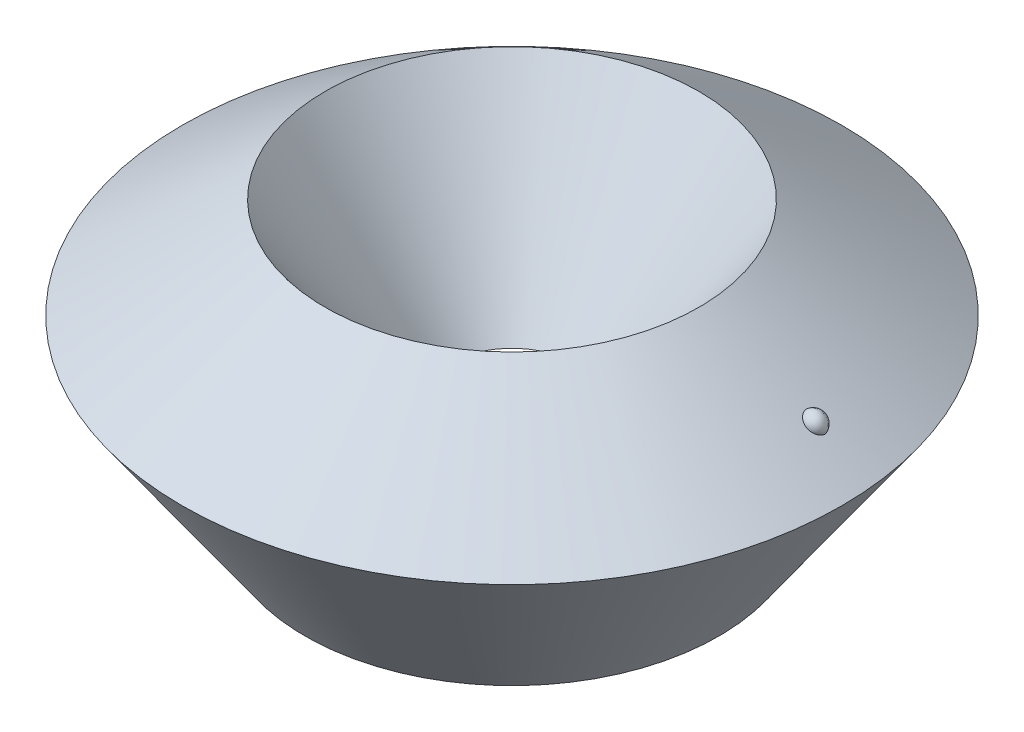
ISO-10303-21;
HEADER;
FILE_DESCRIPTION(('STEP AP214'),'2;1');
FILE_NAME('part.step','',(''),(''),'','','');
FILE_SCHEMA(('AUTOMOTIVE_DESIGN { 1 0 10303 214 1 1 1 1 }'));
ENDSEC;
DATA;
#1=APPLICATION_CONTEXT('core data for automotive mechanical design processes');
#2=APPLICATION_PROTOCOL_DEFINITION('international standard','automotive_design',2000,#1);
#3=PRODUCT_CONTEXT('',#1,'mechanical');
#4=PRODUCT('Part','Part','',(#3));
#5=PRODUCT_RELATED_PRODUCT_CATEGORY('part','',(#4));
#6=PRODUCT_DEFINITION_FORMATION('','',#4);
#7=PRODUCT_DEFINITION_CONTEXT('part definition',#1,'design');
#8=PRODUCT_DEFINITION('design','',#6,#7);
#9=PRODUCT_DEFINITION_SHAPE('','',#8);
#10=(LENGTH_UNIT() NAMED_UNIT(*) SI_UNIT(.MILLI.,.METRE.));
#11=(NAMED_UNIT(*) PLANE_ANGLE_UNIT() SI_UNIT($,.RADIAN.));
#12=(NAMED_UNIT(*) SI_UNIT($,.STERADIAN.) SOLID_ANGLE_UNIT());
#13=UNCERTAINTY_MEASURE_WITH_UNIT(LENGTH_MEASURE(1.E-05),#10,'distance_accuracy_value','');
#14=(GEOMETRIC_REPRESENTATION_CONTEXT(3) GLOBAL_UNCERTAINTY_ASSIGNED_CONTEXT((#13)) GLOBAL_UNIT_ASSIGNED_CONTEXT((#10,
#11,#12)) REPRESENTATION_CONTEXT('',''));
#15=CARTESIAN_POINT('',(0.,0.,0.));
#16=DIRECTION('',(0.,0.,1.));
#17=DIRECTION('',(1.,0.,0.));
#18=AXIS2_PLACEMENT_3D('',#15,#16,#17);
#19=CARTESIAN_POINT('',(0.,646.822572834616,0.));
#20=DIRECTION('',(0.,-1.,0.));
#21=DIRECTION('',(0.,0.,-1.));
#22=AXIS2_PLACEMENT_3D('',#19,#20,#21);
#23=CONICAL_SURFACE('',#22,626.447108873286,0.956902543493091);
#24=CARTESIAN_POINT('',(0.,646.822572834616,0.));
#25=DIRECTION('',(0.,-1.,0.));
#26=DIRECTION('',(0.,0.,-1.));
#27=AXIS2_PLACEMENT_3D('',#24,#25,#26);
#28=CIRCLE('',#27,626.447108873286);
#29=CARTESIAN_POINT('',(0.,646.822572834616,-626.447108873286));
#30=VERTEX_POINT('',#29);
#31=EDGE_CURVE('E60',#30,#30,#28,.T.);
#32=ORIENTED_EDGE('',*,*,#31,.T.);
#33=EDGE_LOOP('',(#32));
#34=FACE_BOUND('',#33,.T.);
#35=CARTESIAN_POINT('',(0.,309.874222783093,0.));
#36=DIRECTION('',(0.,-1.,0.));
#37=DIRECTION('',(0.,0.,-1.));
#38=AXIS2_PLACEMENT_3D('',#35,#36,#37);
#39=CIRCLE('',#38,1104.57076512448);
#40=CARTESIAN_POINT('',(0.,309.874222783093,-1104.57076512448));
#41=VERTEX_POINT('',#40);
#42=EDGE_CURVE('E93',#41,#41,#39,.T.);
#43=ORIENTED_EDGE('',*,*,#42,.F.);
#44=EDGE_LOOP('',(#43));
#45=FACE_BOUND('',#44,.T.);
#46=CARTESIAN_POINT('',(903.677838093936,449.01694573166,-79.061566312835));
#47=CARTESIAN_POINT('',(903.677842370877,449.016943879104,-79.0615475886074));
#48=CARTESIAN_POINT('',(903.67784664783,449.016942026541,-79.0615288643833));
#49=CARTESIAN_POINT('',(903.677865701773,449.016933773302,-79.0614454476838));
#50=CARTESIAN_POINT('',(903.677880478887,449.016927372532,-79.0613807552462));
#51=CARTESIAN_POINT('',(903.677954365137,449.016895368172,-79.0610572932636));
#52=CARTESIAN_POINT('',(903.678013476306,449.016869763039,-79.0607985243357));
#53=CARTESIAN_POINT('',(903.678309042997,449.016741729157,-79.0595046829867));
#54=CARTESIAN_POINT('',(903.678545531061,449.016639275747,-79.0584696204394));
#55=CARTESIAN_POINT('',(903.679728144942,449.016126877171,-79.0532943603268));
#56=CARTESIAN_POINT('',(903.680674791402,449.015716537445,-79.0491543207984));
#57=CARTESIAN_POINT('',(903.685410801045,449.013662734279,-79.0284549634441));
#58=CARTESIAN_POINT('',(903.68920849385,449.012012958262,-79.0118981770027));
#59=CARTESIAN_POINT('',(903.708241419441,449.003730395689,-78.9291275923634));
#60=CARTESIAN_POINT('',(903.723609883134,448.996996628279,-78.8629545101744));
#61=CARTESIAN_POINT('',(903.801165179077,448.962788236649,-78.5322960187969));
#62=CARTESIAN_POINT('',(903.865481098766,448.933699213061,-78.2684744692414));
#63=CARTESIAN_POINT('',(904.065310623159,448.841235950445,-77.4788837273956));
#64=CARTESIAN_POINT('',(904.20761451631,448.772703580202,-76.9554115368223));
#65=CARTESIAN_POINT('',(904.510139994187,448.621993079532,-75.9153206773698));
#66=CARTESIAN_POINT('',(904.67037253104,448.539806593147,-75.3987064157221));
#67=CARTESIAN_POINT('',(905.004621619618,448.363972603443,-74.385065251873));
#68=CARTESIAN_POINT('',(905.178249689312,448.27062257485,-73.8878586946291));
#69=CARTESIAN_POINT('',(905.54200150098,448.071247677002,-72.9020799189372));
#70=CARTESIAN_POINT('',(905.732125783938,447.965222392026,-72.4135079842892));
#71=CARTESIAN_POINT('',(906.128631105811,447.740654926096,-71.445667019237));
#72=CARTESIAN_POINT('',(906.335019026927,447.622107438883,-70.9664020352953));
#73=CARTESIAN_POINT('',(906.763657467021,447.372748089205,-70.0181677215243));
#74=CARTESIAN_POINT('',(906.985911594164,447.241933434904,-69.5492007654994));
#75=CARTESIAN_POINT('',(907.67664000602,446.831028107147,-68.1575828626541));
#76=CARTESIAN_POINT('',(908.168485716866,446.532813024993,-67.2516663365754));
#77=CARTESIAN_POINT('',(909.210914679791,445.890503819018,-65.4913463895806));
#78=CARTESIAN_POINT('',(909.761498452138,445.546409288816,-64.6369434250478));
#79=CARTESIAN_POINT('',(910.628217678452,444.998104393447,-63.3990075085989));
#80=CARTESIAN_POINT('',(910.923853961712,444.810025566284,-62.9937341877159));
#81=CARTESIAN_POINT('',(911.528265868882,444.423493770551,-62.1983585330809));
#82=CARTESIAN_POINT('',(911.837038080214,444.225043493353,-61.8082523088702));
#83=CARTESIAN_POINT('',(912.467292779461,443.818086025995,-61.0437735221812));
#84=CARTESIAN_POINT('',(912.788776912032,443.60957753374,-60.6694030085867));
#85=CARTESIAN_POINT('',(913.443862064001,443.182930258594,-59.9371095540181));
#86=CARTESIAN_POINT('',(913.777463898587,442.964790827592,-59.5791877232725));
#87=CARTESIAN_POINT('',(914.795220701802,442.296788872934,-58.5314686003668));
#88=CARTESIAN_POINT('',(915.496802148189,441.833035729104,-57.8671413744107));
#89=CARTESIAN_POINT('',(916.941207610036,440.872267784866,-56.6116534644799));
#90=CARTESIAN_POINT('',(917.684031275878,440.375253266414,-56.0204921604011));
#91=CARTESIAN_POINT('',(919.206203580861,439.351439625148,-54.9152032645878));
#92=CARTESIAN_POINT('',(919.98556586454,438.824629360368,-54.4011047559313));
#93=CARTESIAN_POINT('',(921.575130008313,437.745359286381,-53.4539052946254));
#94=CARTESIAN_POINT('',(922.38533194111,437.192899416703,-53.0208045329397));
#95=CARTESIAN_POINT('',(924.031025331838,436.066381308796,-52.2386444049249));
#96=CARTESIAN_POINT('',(924.8665190971,435.492321098836,-51.8895927324194));
#97=CARTESIAN_POINT('',(926.556891192163,434.326886657188,-51.2780737960379));
#98=CARTESIAN_POINT('',(927.411769513079,433.735512433435,-51.01560649248));
#99=CARTESIAN_POINT('',(929.134905813546,432.539787152489,-50.5791312208283));
#100=CARTESIAN_POINT('',(930.003163565366,431.9354363161,-50.4051217488046));
#101=CARTESIAN_POINT('',(931.746962699832,430.718134328927,-50.146797116923));
#102=CARTESIAN_POINT('',(932.622504082971,430.10518317756,-50.0624819631301));
#103=CARTESIAN_POINT('',(934.374671417371,428.875100401077,-49.984148544978));
#104=CARTESIAN_POINT('',(935.251297354015,428.257968831815,-49.990129076569));
#105=CARTESIAN_POINT('',(936.999424483006,427.02392154655,-50.0923423990642));
#106=CARTESIAN_POINT('',(937.870925675617,426.407005830536,-50.1885751853307));
#107=CARTESIAN_POINT('',(939.602561516553,425.177778538085,-50.4706027038938));
#108=CARTESIAN_POINT('',(940.462696575909,424.565466795503,-50.6563941883389));
#109=CARTESIAN_POINT('',(942.165478224076,423.349721900965,-51.1162141751298));
#110=CARTESIAN_POINT('',(943.00812481269,422.746288749108,-51.3902426784593));
#111=CARTESIAN_POINT('',(944.66989204048,421.552489739351,-52.0245903243208));
#112=CARTESIAN_POINT('',(945.489012229035,420.962124131794,-52.3849111184455));
#113=CARTESIAN_POINT('',(947.097802024977,419.798548616245,-53.1892731497834));
#114=CARTESIAN_POINT('',(947.887471634883,419.225338706787,-53.6333143798353));
#115=CARTESIAN_POINT('',(949.431694012297,418.099964729108,-54.6019851728418));
#116=CARTESIAN_POINT('',(950.186244462573,417.547802050059,-55.1266200437277));
#117=CARTESIAN_POINT('',(951.654690001792,416.468316912498,-56.2527197585638));
#118=CARTESIAN_POINT('',(952.368585057289,415.940994474421,-56.854184665718));
#119=CARTESIAN_POINT('',(953.750425409259,414.914815376313,-58.1295771154348));
#120=CARTESIAN_POINT('',(954.418376340914,414.415955226584,-58.8034957452541));
#121=CARTESIAN_POINT('',(955.7035395065,413.44997319669,-60.2190648159457));
#122=CARTESIAN_POINT('',(956.320751939917,412.982851191743,-60.9607149904981));
#123=CARTESIAN_POINT('',(957.499755480273,412.08357366604,-62.506250506976));
#124=CARTESIAN_POINT('',(958.061559039174,411.651410293021,-63.3101217932278));
#125=CARTESIAN_POINT('',(959.125848474851,410.824727209333,-64.9746948507627));
#126=CARTESIAN_POINT('',(959.62833344095,410.430208076608,-65.8353974942222));
#127=CARTESIAN_POINT('',(960.334779321259,409.868620382726,-67.1644228553372));
#128=CARTESIAN_POINT('',(960.562471959983,409.686381824671,-67.6139687445639));
#129=CARTESIAN_POINT('',(961.001649281969,409.332285560535,-68.5249090990918));
#130=CARTESIAN_POINT('',(961.21313502498,409.160427175863,-68.9863027870422));
#131=CARTESIAN_POINT('',(961.619469785914,408.827401469633,-69.9200472421563));
#132=CARTESIAN_POINT('',(961.814321350276,408.666232512532,-70.3923963180876));
#133=CARTESIAN_POINT('',(962.18710406613,408.354785947675,-71.347369216708));
#134=CARTESIAN_POINT('',(962.365030961267,408.204511081902,-71.8299955868631));
#135=CARTESIAN_POINT('',(962.866309566374,407.776045148428,-73.273049341905));
#136=CARTESIAN_POINT('',(963.165087287059,407.513715164434,-74.2469095778576));
#137=CARTESIAN_POINT('',(963.693865087079,407.033732923899,-76.2238497794878));
#138=CARTESIAN_POINT('',(963.923866894425,406.816079544891,-77.2269290103357));
#139=CARTESIAN_POINT('',(964.215810685988,406.524370965594,-78.7468635872954));
#140=CARTESIAN_POINT('',(964.304214774281,406.433010481004,-79.255500114643));
#141=CARTESIAN_POINT('',(964.463345954638,406.261883581773,-80.2774007784206));
#142=CARTESIAN_POINT('',(964.534076376941,406.182114984067,-80.7906640241277));
#143=CARTESIAN_POINT('',(964.657707917526,406.03432601235,-81.8207036182893));
#144=CARTESIAN_POINT('',(964.710618861846,405.966299173806,-82.3374778697814));
#145=CARTESIAN_POINT('',(964.7985669476,405.842046763109,-83.3739244053516));
#146=CARTESIAN_POINT('',(964.833606473567,405.785819617144,-83.893596293447));
#147=CARTESIAN_POINT('',(964.859677997821,405.735537196828,-84.4142455212627));
#148=CARTESIAN_POINT('',(964.85967895837,405.735535344265,-84.4142647037088));
#149=CARTESIAN_POINT('',(964.859679918907,405.73553349171,-84.4142838861562));
#150=B_SPLINE_CURVE_WITH_KNOTS('',3,(#46,#47,#48,#49,#50,#51,#52,#53,#54,#55,#56,#57,#58,#59,
#60,#61,#62,#63,#64,#65,#66,#67,#68,#69,#70,#71,#72,#73,#74,#75,#76,#77,#78,#79,#80,#81,#82,#83,
#84,#85,#86,#87,#88,#89,#90,#91,#92,#93,#94,#95,#96,#97,#98,#99,#100,#101,#102,#103,#104,#105,
#106,#107,#108,#109,#110,#111,#112,#113,#114,#115,#116,#117,#118,#119,#120,#121,#122,#123,#124,
#125,#126,#127,#128,#129,#130,#131,#132,#133,#134,#135,#136,#137,#138,#139,#140,#141,#142,#143,
#144,#145,#146,#147,#148,#149),.UNSPECIFIED.,.F.,.F.,(4,2,2,2,2,2,2,2,2,2,2,2,2,2,2,2,2,2,2,2,2,
2,2,2,2,2,2,2,2,2,2,2,2,2,2,2,2,2,2,2,2,2,2,2,2,2,2,2,2,2,2,4),(0.,5.78868549013548E-05,
0.000257886854916139,0.00105788685494971,0.004257886857777,0.0170578870384815,
0.0682578986025449,0.273058638710318,1.09230601435445,2.7321032833768,4.37290778649738,
5.97701136545827,7.58116756988731,9.18600628017126,10.7912111197621,14.0064182377562,
17.2216538366257,18.8284849136749,20.4349010716615,22.0415257507711,23.648258712638,
26.8593096853803,30.0703334415985,33.2825659860827,36.4948061037674,39.7073401570779,
42.9198727380716,46.1323506988497,49.3448288768473,52.5572642180237,55.7696993941287,
58.9820180798424,62.1943368013692,65.4067170100377,68.6190969439292,71.8316885373034,
75.0442827735211,78.2564822703692,81.4686691374202,84.6801324813171,87.8916451221927,
89.4988349367776,91.1059195694742,92.7127577392521,94.319998947368,97.4718644718133,
100.623650798197,102.196130439682,103.768313556003,105.339628312287,106.910733357409,
106.910791244264),.UNSPECIFIED.);
#151=CARTESIAN_POINT('',(903.677838093936,449.01694573166,-79.061566312835));
#152=VERTEX_POINT('',#151);
#153=CARTESIAN_POINT('',(964.859679918907,405.73553349171,-84.4142838861562));
#154=VERTEX_POINT('',#153);
#155=EDGE_CURVE('E11',#152,#154,#150,.T.);
#156=ORIENTED_EDGE('',*,*,#155,.F.);
#157=CARTESIAN_POINT('',(964.859679918907,405.73553349171,-84.4142838861562));
#158=CARTESIAN_POINT('',(964.859675641966,405.735535344265,-84.4143026103837));
#159=CARTESIAN_POINT('',(964.859671365012,405.735537196828,-84.4143213346077));
#160=CARTESIAN_POINT('',(964.859652311066,405.735545450062,-84.4144047513067));
#161=CARTESIAN_POINT('',(964.859637533945,405.735551850821,-84.4144694437438));
#162=CARTESIAN_POINT('',(964.859563647636,405.735583855098,-84.4147929057212));
#163=CARTESIAN_POINT('',(964.859504536347,405.735609460059,-84.4150516746385));
#164=CARTESIAN_POINT('',(964.859208968687,405.735737492562,-84.4163455159027));
#165=CARTESIAN_POINT('',(964.858972478678,405.735839943202,-84.4173805782799));
#166=CARTESIAN_POINT('',(964.857789849218,405.736352319585,-84.4225558370296));
#167=CARTESIAN_POINT('',(964.856843171558,405.73676261487,-84.4266958738284));
#168=CARTESIAN_POINT('',(964.852106912258,405.738816062427,-84.4473952093402));
#169=CARTESIAN_POINT('',(964.848308720028,405.74046512706,-84.4639519520878));
#170=CARTESIAN_POINT('',(964.829271799764,405.748741999604,-84.5467221872308));
#171=CARTESIAN_POINT('',(964.81389534818,405.755464389043,-84.6128945705817));
#172=CARTESIAN_POINT('',(964.736276218416,405.789581855272,-84.9435474766945));
#173=CARTESIAN_POINT('',(964.671832769053,405.818489225088,-85.2073578694691));
#174=CARTESIAN_POINT('',(964.471393660326,405.910084177206,-85.9968952558046));
#175=CARTESIAN_POINT('',(964.32838055056,405.977606320425,-86.5203053895306));
#176=CARTESIAN_POINT('',(964.023849081566,406.125459473614,-87.5602208481951));
#177=CARTESIAN_POINT('',(963.862319409237,406.205798326101,-88.0767217342835));
#178=CARTESIAN_POINT('',(963.524943309841,406.377184598849,-89.0900998451972));
#179=CARTESIAN_POINT('',(963.349497515271,406.46795257458,-89.5871576606137));
#180=CARTESIAN_POINT('',(962.981594824102,406.661430652003,-90.5725937404977));
#181=CARTESIAN_POINT('',(962.789137369664,406.764141145345,-91.0609717197079));
#182=CARTESIAN_POINT('',(962.387477680179,406.981385322838,-92.0283819313029));
#183=CARTESIAN_POINT('',(962.178268355891,407.095924018582,-92.5074100991332));
#184=CARTESIAN_POINT('',(961.743531408284,407.336618090553,-93.4551307310302));
#185=CARTESIAN_POINT('',(961.518000072791,407.462776111195,-93.9238208120434));
#186=CARTESIAN_POINT('',(960.816796700668,407.858797186946,-95.3145514170716));
#187=CARTESIAN_POINT('',(960.317117776826,408.145881540353,-96.219801572962));
#188=CARTESIAN_POINT('',(959.257643927261,408.763970717751,-97.9786666586573));
#189=CARTESIAN_POINT('',(958.697848470168,409.094975929967,-98.832281131949));
#190=CARTESIAN_POINT('',(957.816545873764,409.622559603781,-100.068966010233));
#191=CARTESIAN_POINT('',(957.515922006523,409.803552100434,-100.473811209015));
#192=CARTESIAN_POINT('',(956.901325229036,410.175613527837,-101.268311607677));
#193=CARTESIAN_POINT('',(956.587355785883,410.366679844536,-101.65797070299));
#194=CARTESIAN_POINT('',(955.94654208103,410.758635910004,-102.421540082664));
#195=CARTESIAN_POINT('',(955.619696153319,410.959526930749,-102.795448316078));
#196=CARTESIAN_POINT('',(954.953771272049,411.37077460146,-103.526806198587));
#197=CARTESIAN_POINT('',(954.614691495495,411.581131888478,-103.884254736708));
#198=CARTESIAN_POINT('',(953.580405083706,412.225651885932,-104.930544161143));
#199=CARTESIAN_POINT('',(952.86766808589,412.673558231162,-105.593904494943));
#200=CARTESIAN_POINT('',(951.401066404941,413.602797809648,-106.847464261683));
#201=CARTESIAN_POINT('',(950.647202071117,414.084130759009,-107.437664315862));
#202=CARTESIAN_POINT('',(949.103451285692,415.077258878812,-108.541054549552));
#203=CARTESIAN_POINT('',(948.313552254803,415.589064706298,-109.05421756393));
#204=CARTESIAN_POINT('',(946.703758894691,416.639525238041,-109.999618649008));
#205=CARTESIAN_POINT('',(945.883864495278,417.178180005126,-110.431856530327));
#206=CARTESIAN_POINT('',(944.21995170242,418.278745112861,-111.212391738866));
#207=CARTESIAN_POINT('',(943.375931108108,418.840657577258,-111.560681380554));
#208=CARTESIAN_POINT('',(941.669953291749,419.983856389231,-112.170802031969));
#209=CARTESIAN_POINT('',(940.807996077731,420.565142728134,-112.432633080393));
#210=CARTESIAN_POINT('',(939.072375788359,421.743087750786,-112.867983857919));
#211=CARTESIAN_POINT('',(938.198712825912,422.339746286313,-113.041504438187));
#212=CARTESIAN_POINT('',(936.445959554773,423.544306367568,-113.299012166282));
#213=CARTESIAN_POINT('',(935.566869245697,424.152207914092,-113.382999307757));
#214=CARTESIAN_POINT('',(933.809575879031,425.374998874307,-113.460848091577));
#215=CARTESIAN_POINT('',(932.931372809749,425.989888194572,-113.454710937443));
#216=CARTESIAN_POINT('',(931.182114362589,427.222331279776,-113.352360676321));
#217=CARTESIAN_POINT('',(930.311058984321,427.839885044571,-113.256147574231));
#218=CARTESIAN_POINT('',(928.582322724304,429.073248231189,-112.974334837439));
#219=CARTESIAN_POINT('',(927.724641365545,429.689057714582,-112.788738398328));
#220=CARTESIAN_POINT('',(926.028695657567,430.914543542796,-112.329477353821));
#221=CARTESIAN_POINT('',(925.190431308583,431.524219887544,-112.055812747363));
#222=CARTESIAN_POINT('',(923.539214465473,432.733047108434,-111.422349701959));
#223=CARTESIAN_POINT('',(922.726262454748,433.332197783467,-111.062549619182));
#224=CARTESIAN_POINT('',(921.131393154259,434.515597571507,-110.259368531401));
#225=CARTESIAN_POINT('',(920.349475861643,435.099846685882,-109.815987534076));
#226=CARTESIAN_POINT('',(918.822094915387,436.24918558452,-108.848759129727));
#227=CARTESIAN_POINT('',(918.076633338306,436.814274276822,-108.324907146006));
#228=CARTESIAN_POINT('',(916.627393784647,437.921074744,-107.200465982648));
#229=CARTESIAN_POINT('',(915.923615842139,438.46278649977,-106.599876740294));
#230=CARTESIAN_POINT('',(914.562698945271,439.518724973808,-105.326298628964));
#231=CARTESIAN_POINT('',(913.905554275272,440.032955058472,-104.653318658134));
#232=CARTESIAN_POINT('',(912.642329562766,441.030140352846,-103.23965796148));
#233=CARTESIAN_POINT('',(912.0362493198,441.513095685327,-102.498977501446));
#234=CARTESIAN_POINT('',(910.87944901624,442.443959637683,-100.955374160917));
#235=CARTESIAN_POINT('',(910.328716830276,442.891875928946,-100.15246498174));
#236=CARTESIAN_POINT('',(909.286131520578,443.74943859256,-98.4897788485426));
#237=CARTESIAN_POINT('',(908.794279301443,444.159084376923,-97.6300010211394));
#238=CARTESIAN_POINT('',(908.103169186404,444.74248741803,-96.3023098125121));
#239=CARTESIAN_POINT('',(907.880488352387,444.931854959155,-95.8532000055007));
#240=CARTESIAN_POINT('',(907.451083964272,445.29985186531,-94.9431100251724));
#241=CARTESIAN_POINT('',(907.244359366829,445.478481932271,-94.4821306306157));
#242=CARTESIAN_POINT('',(906.847250935695,445.824629192464,-93.5491889850458));
#243=CARTESIAN_POINT('',(906.6568646004,445.99214808607,-93.0772284295111));
#244=CARTESIAN_POINT('',(906.292675595879,446.315814654206,-92.123003182964));
#245=CARTESIAN_POINT('',(906.118877098183,446.471959466043,-91.6407359371373));
#246=CARTESIAN_POINT('',(905.629275442977,446.916997938013,-90.1987327968837));
#247=CARTESIAN_POINT('',(905.337505956772,447.189265817585,-89.2255184511087));
#248=CARTESIAN_POINT('',(904.821001694765,447.686651593838,-87.2497201200071));
#249=CARTESIAN_POINT('',(904.5962652324,447.91177067675,-86.2471368743052));
#250=CARTESIAN_POINT('',(904.310732808191,448.212568386836,-84.7278176241066));
#251=CARTESIAN_POINT('',(904.224216821952,448.30660524137,-84.2193646508777));
#252=CARTESIAN_POINT('',(904.068346699656,448.48235385492,-83.1977864323982));
#253=CARTESIAN_POINT('',(903.998989330752,448.564067934528,-82.6846620861962));
#254=CARTESIAN_POINT('',(903.877567331944,448.714986369959,-81.6548536941956));
#255=CARTESIAN_POINT('',(903.825493172045,448.784197610243,-81.138171771029));
#256=CARTESIAN_POINT('',(903.738665927795,448.910034322491,-80.1018618484952));
#257=CARTESIAN_POINT('',(903.703910532623,448.966661472975,-79.5822342515282));
#258=CARTESIAN_POINT('',(903.677840015022,449.016942026541,-79.0616046777286));
#259=CARTESIAN_POINT('',(903.677839054473,449.016943879104,-79.0615854952824));
#260=CARTESIAN_POINT('',(903.677838093936,449.01694573166,-79.061566312835));
#261=B_SPLINE_CURVE_WITH_KNOTS('',3,(#157,#158,#159,#160,#161,#162,#163,#164,#165,#166,#167,
#168,#169,#170,#171,#172,#173,#174,#175,#176,#177,#178,#179,#180,#181,#182,#183,#184,#185,#186,
#187,#188,#189,#190,#191,#192,#193,#194,#195,#196,#197,#198,#199,#200,#201,#202,#203,#204,#205,
#206,#207,#208,#209,#210,#211,#212,#213,#214,#215,#216,#217,#218,#219,#220,#221,#222,#223,#224,
#225,#226,#227,#228,#229,#230,#231,#232,#233,#234,#235,#236,#237,#238,#239,#240,#241,#242,#243,
#244,#245,#246,#247,#248,#249,#250,#251,#252,#253,#254,#255,#256,#257,#258,#259,#260),
.UNSPECIFIED.,.F.,.F.,(4,2,2,2,2,2,2,2,2,2,2,2,2,2,2,2,2,2,2,2,2,2,2,2,2,2,2,2,2,2,2,2,2,2,2,2,
2,2,2,2,2,2,2,2,2,2,2,2,2,2,2,4),(0.,5.78868547029063E-05,0.000257886854702814,
0.00105788685475341,0.00425788685758799,0.0170578870382603,0.0682578986015246,0.27305863865927,
1.09230601114811,2.73210314814904,4.3729075494541,5.97704261418606,7.58123030066686,
9.18610048984992,10.7913368344558,14.0066068429311,17.2219052735848,18.8287691005753,
20.4352179961884,22.0418754276711,23.6486411445179,26.8597574526699,30.0708464918609,
33.2830651928125,36.495291410918,39.7078115994425,42.9203303500815,46.1328181367724,
49.3453061513877,52.5577512664558,55.7701962068367,58.9825263058956,62.1948564436593,
65.4072478912283,68.6196390436419,71.8322129648992,75.0447895118043,78.2569716245028,
81.4691411267935,84.6806053823283,87.8921189707092,89.499309070703,91.1063939907663,
92.7132324041247,94.3204738482807,97.4722206451365,100.623888136708,102.196308387097,
103.768432152563,105.339687600209,106.910733341092,106.910791227947),.UNSPECIFIED.);
#262=EDGE_CURVE('E50',#154,#152,#261,.T.);
#263=ORIENTED_EDGE('',*,*,#262,.F.);
#264=EDGE_LOOP('',(#156,#263));
#265=FACE_BOUND('',#264,.T.);
#266=ADVANCED_FACE('F36',(#34,#45,#265),#23,.T.);
#267=CARTESIAN_POINT('',(0.,-274.163233074116,0.));
#268=DIRECTION('',(0.,-1.,0.));
#269=DIRECTION('',(0.,0.,-1.));
#270=AXIS2_PLACEMENT_3D('',#267,#268,#269);
#271=CONICAL_SURFACE('',#270,692.981724200749,0.956902543493091);
#272=CARTESIAN_POINT('',(0.,62.7851169774079,0.));
#273=DIRECTION('',(0.,-1.,0.));
#274=DIRECTION('',(0.,0.,-1.));
#275=AXIS2_PLACEMENT_3D('',#272,#273,#274);
#276=CIRCLE('',#275,214.858067949556);
#277=CARTESIAN_POINT('',(0.,62.7851169774079,-214.858067949556));
#278=VERTEX_POINT('',#277);
#279=EDGE_CURVE('E58',#278,#278,#276,.T.);
#280=CARTESIAN_POINT('',(0.,-274.163233074116,0.));
#281=DIRECTION('',(0.,-1.,0.));
#282=DIRECTION('',(0.,0.,-1.));
#283=AXIS2_PLACEMENT_3D('',#280,#281,#282);
#284=CIRCLE('',#283,692.981724200749);
#285=CARTESIAN_POINT('',(0.,-274.163233074116,-692.981724200749));
#286=VERTEX_POINT('',#285);
#287=EDGE_CURVE('E94',#286,#286,#284,.T.);
#288=CARTESIAN_POINT('',(0.,62.7851169774079,-214.858067949556));
#289=CARTESIAN_POINT('',(0.,59.2752383310379,-219.838522702172));
#290=CARTESIAN_POINT('',(0.,55.7653596846678,-224.818977454789));
#291=CARTESIAN_POINT('',(0.,48.7456023919278,-234.779886960022));
#292=CARTESIAN_POINT('',(0.,45.2357237455577,-239.760341712639));
#293=CARTESIAN_POINT('',(0.,38.2159664528177,-249.721251217872));
#294=CARTESIAN_POINT('',(0.,34.7060878064476,-254.701705970488));
#295=CARTESIAN_POINT('',(0.,27.6863305137076,-264.662615475721));
#296=CARTESIAN_POINT('',(0.,24.1764518673375,-269.643070228338));
#297=CARTESIAN_POINT('',(0.,17.1566945745975,-279.603979733571));
#298=CARTESIAN_POINT('',(0.,13.6468159282274,-284.584434486188));
#299=CARTESIAN_POINT('',(0.,6.62705863548735,-294.545343991421));
#300=CARTESIAN_POINT('',(0.,3.11717998911732,-299.525798744038));
#301=CARTESIAN_POINT('',(0.,-3.90257730362275,-309.486708249271));
#302=CARTESIAN_POINT('',(0.,-7.41245594999279,-314.467163001887));
#303=CARTESIAN_POINT('',(0.,-14.4322132427329,-324.428072507121));
#304=CARTESIAN_POINT('',(0.,-17.9420918891029,-329.408527259737));
#305=CARTESIAN_POINT('',(0.,-24.961849181843,-339.36943676497));
#306=CARTESIAN_POINT('',(0.,-28.471727828213,-344.349891517587));
#307=CARTESIAN_POINT('',(0.,-35.4914851209531,-354.31080102282));
#308=CARTESIAN_POINT('',(0.,-39.0013637673231,-359.291255775437));
#309=CARTESIAN_POINT('',(0.,-46.0211210600632,-369.25216528067));
#310=CARTESIAN_POINT('',(0.,-49.5309997064332,-374.232620033286));
#311=CARTESIAN_POINT('',(0.,-56.5507569991733,-384.19352953852));
#312=CARTESIAN_POINT('',(0.,-60.0606356455433,-389.173984291136));
#313=CARTESIAN_POINT('',(0.,-67.0803929382834,-399.13489379637));
#314=CARTESIAN_POINT('',(0.,-70.5902715846535,-404.115348548986));
#315=CARTESIAN_POINT('',(0.,-77.6100288773935,-414.076258054219));
#316=CARTESIAN_POINT('',(0.,-81.1199075237636,-419.056712806836));
#317=CARTESIAN_POINT('',(0.,-88.1396648165036,-429.017622312069));
#318=CARTESIAN_POINT('',(0.,-91.6495434628737,-433.998077064686));
#319=CARTESIAN_POINT('',(0.,-98.6693007556137,-443.958986569919));
#320=CARTESIAN_POINT('',(0.,-102.179179401984,-448.939441322535));
#321=CARTESIAN_POINT('',(0.,-109.198936694724,-458.900350827769));
#322=CARTESIAN_POINT('',(0.,-112.708815341094,-463.880805580385));
#323=CARTESIAN_POINT('',(0.,-119.728572633834,-473.841715085618));
#324=CARTESIAN_POINT('',(0.,-123.238451280204,-478.822169838235));
#325=CARTESIAN_POINT('',(0.,-130.258208572944,-488.783079343468));
#326=CARTESIAN_POINT('',(0.,-133.768087219314,-493.763534096085));
#327=CARTESIAN_POINT('',(0.,-140.787844512054,-503.724443601318));
#328=CARTESIAN_POINT('',(0.,-144.297723158424,-508.704898353934));
#329=CARTESIAN_POINT('',(0.,-151.317480451164,-518.665807859168));
#330=CARTESIAN_POINT('',(0.,-154.827359097534,-523.646262611784));
#331=CARTESIAN_POINT('',(0.,-161.847116390274,-533.607172117018));
#332=CARTESIAN_POINT('',(0.,-165.356995036644,-538.587626869634));
#333=CARTESIAN_POINT('',(0.,-172.376752329384,-548.548536374867));
#334=CARTESIAN_POINT('',(0.,-175.886630975754,-553.528991127484));
#335=CARTESIAN_POINT('',(0.,-182.906388268495,-563.489900632717));
#336=CARTESIAN_POINT('',(0.,-186.416266914865,-568.470355385334));
#337=CARTESIAN_POINT('',(0.,-193.436024207605,-578.431264890567));
#338=CARTESIAN_POINT('',(0.,-196.945902853975,-583.411719643183));
#339=CARTESIAN_POINT('',(0.,-203.965660146715,-593.372629148417));
#340=CARTESIAN_POINT('',(0.,-207.475538793085,-598.353083901033));
#341=CARTESIAN_POINT('',(0.,-214.495296085825,-608.313993406266));
#342=CARTESIAN_POINT('',(0.,-218.005174732195,-613.294448158883));
#343=CARTESIAN_POINT('',(0.,-225.024932024935,-623.255357664116));
#344=CARTESIAN_POINT('',(0.,-228.534810671305,-628.235812416733));
#345=CARTESIAN_POINT('',(0.,-235.554567964045,-638.196721921966));
#346=CARTESIAN_POINT('',(0.,-239.064446610415,-643.177176674582));
#347=CARTESIAN_POINT('',(0.,-246.084203903155,-653.138086179816));
#348=CARTESIAN_POINT('',(0.,-249.594082549525,-658.118540932432));
#349=CARTESIAN_POINT('',(0.,-256.613839842265,-668.079450437666));
#350=CARTESIAN_POINT('',(0.,-260.123718488635,-673.059905190282));
#351=CARTESIAN_POINT('',(0.,-267.143475781375,-683.020814695515));
#352=CARTESIAN_POINT('',(0.,-270.653354427745,-688.001269448132));
#353=CARTESIAN_POINT('',(0.,-274.163233074116,-692.981724200748));
#354=B_SPLINE_CURVE_WITH_KNOTS('',3,(#288,#289,#290,#291,#292,#293,#294,#295,#296,#297,#298,
#299,#300,#301,#302,#303,#304,#305,#306,#307,#308,#309,#310,#311,#312,#313,#314,#315,#316,#317,
#318,#319,#320,#321,#322,#323,#324,#325,#326,#327,#328,#329,#330,#331,#332,#333,#334,#335,#336,
#337,#338,#339,#340,#341,#342,#343,#344,#345,#346,#347,#348,#349,#350,#351,#352,#353),
.UNSPECIFIED.,.F.,.F.,(4,2,2,2,2,2,2,2,2,2,2,2,2,2,2,2,2,2,2,2,2,2,2,2,2,2,2,2,2,2,2,2,4),(0.,
18.2788839619915,36.557767923983,54.8366518859745,73.115535847966,91.3944198099575,
109.673303771949,127.95218773394,146.231071695932,164.509955657923,182.788839619915,
201.067723581907,219.346607543898,237.62549150589,255.904375467881,274.183259429872,
292.462143391864,310.741027353855,329.019911315847,347.298795277838,365.57767923983,
383.856563201821,402.135447163813,420.414331125804,438.693215087796,456.972099049787,
475.250983011779,493.52986697377,511.808750935762,530.087634897753,548.366518859745,
566.645402821736,584.924286783728),.UNSPECIFIED.);
#355=EDGE_CURVE('BSEAM38',#278,#286,#354,.T.);
#356=ORIENTED_EDGE('',*,*,#279,.F.);
#357=ORIENTED_EDGE('',*,*,#287,.T.);
#358=ORIENTED_EDGE('',*,*,#355,.T.);
#359=ORIENTED_EDGE('',*,*,#355,.F.);
#360=EDGE_LOOP('',(#356,#358,#357,#359));
#361=FACE_BOUND('',#360,.T.);
#362=ADVANCED_FACE('F38',(#361),#271,.F.);
#363=CARTESIAN_POINT('',(0.,62.7851169774079,0.));
#364=DIRECTION('',(0.,1.,0.));
#365=DIRECTION('',(0.,0.,1.));
#366=AXIS2_PLACEMENT_3D('',#363,#364,#365);
#367=CONICAL_SURFACE('',#366,214.858067949556,0.613893783301806);
#368=ORIENTED_EDGE('',*,*,#31,.F.);
#369=EDGE_LOOP('',(#368));
#370=FACE_BOUND('',#369,.T.);
#371=ORIENTED_EDGE('',*,*,#279,.T.);
#372=EDGE_LOOP('',(#371));
#373=FACE_BOUND('',#372,.T.);
#374=ADVANCED_FACE('F74',(#370,#373),#367,.F.);
#375=CARTESIAN_POINT('',(0.,309.874222783093,0.));
#376=DIRECTION('',(0.,1.,0.));
#377=DIRECTION('',(0.,0.,1.));
#378=AXIS2_PLACEMENT_3D('',#375,#376,#377);
#379=CONICAL_SURFACE('',#378,1104.57076512448,0.613893783301806);
#380=ORIENTED_EDGE('',*,*,#287,.F.);
#381=EDGE_LOOP('',(#380));
#382=FACE_BOUND('',#381,.T.);
#383=ORIENTED_EDGE('',*,*,#42,.T.);
#384=EDGE_LOOP('',(#383));
#385=FACE_BOUND('',#384,.T.);
#386=ADVANCED_FACE('F71',(#382,#385),#379,.T.);
#387=CARTESIAN_POINT('',(937.936024296819,432.56022121754,-81.7379250994956));
#388=DIRECTION('',(-0.0581602564282768,0.0411438747080351,-0.997459054872032));
#389=DIRECTION('',(-0.577522092976038,-0.816375056040161,0.));
#390=AXIS2_PLACEMENT_3D('',#387,#388,#389);
#391=CIRCLE('',#390,38.1);
#392=TRIMMED_CURVE('',#391,(PARAMETER_VALUE(-1.40334824757521)),
(PARAMETER_VALUE(1.40334824757521)),.T.,.PARAMETER.);
#393=CARTESIAN_POINT('',(934.268759006422,427.376239611685,-81.7379250994956));
#394=DIRECTION('',(-0.814300691818921,0.576054641027596,0.0712420792354729));
#395=AXIS1_PLACEMENT('',#393,#394);
#396=SURFACE_OF_REVOLUTION('',#392,#395);
#397=ORIENTED_EDGE('',*,*,#262,.T.);
#398=ORIENTED_EDGE('',*,*,#155,.T.);
#399=EDGE_LOOP('',(#397,#398));
#400=FACE_BOUND('',#399,.T.);
#401=ADVANCED_FACE('F57',(#400),#396,.T.);
#402=CLOSED_SHELL('',(#266,#362,#374,#386,#401));
#403=MANIFOLD_SOLID_BREP('B2',#402);
#404=ADVANCED_BREP_SHAPE_REPRESENTATION('',(#18,#403),#14);
#405=SHAPE_DEFINITION_REPRESENTATION(#9,#404);
ENDSEC;
END-ISO-10303-21;
